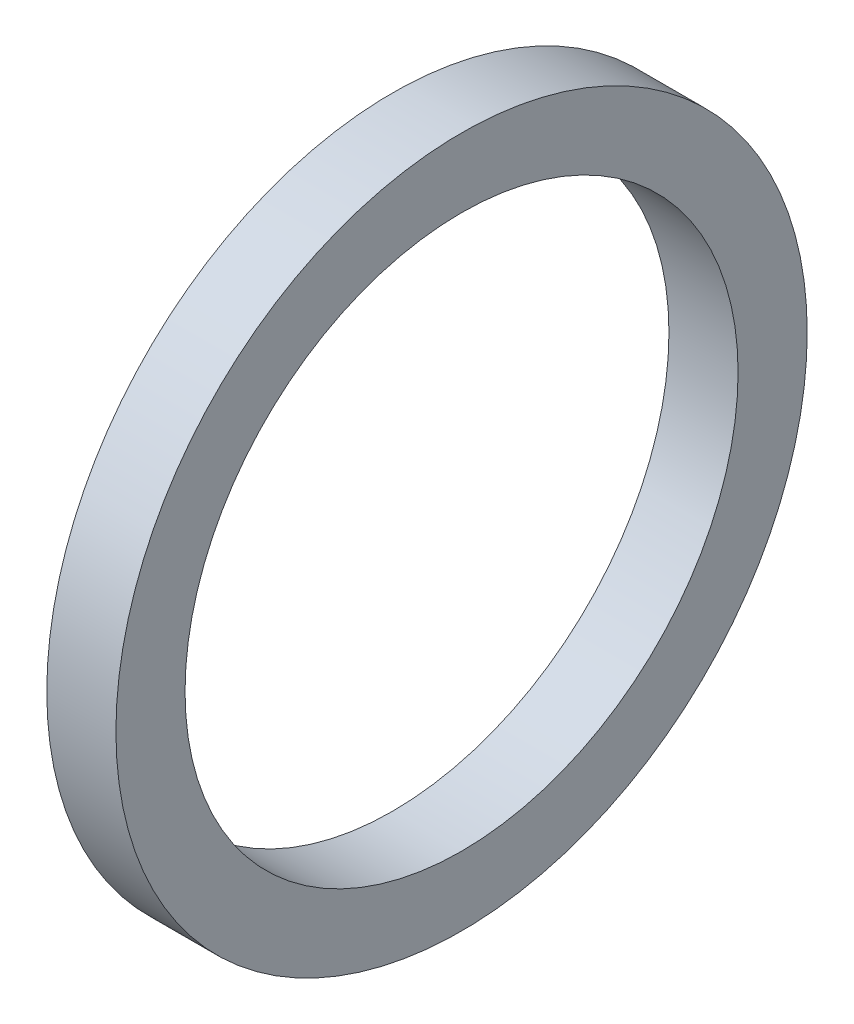
ISO-10303-21;
HEADER;
FILE_DESCRIPTION(('STEP AP214'),'2;1');
FILE_NAME('part.step','',(''),(''),'','','');
FILE_SCHEMA(('AUTOMOTIVE_DESIGN { 1 0 10303 214 1 1 1 1 }'));
ENDSEC;
DATA;
#1=APPLICATION_CONTEXT('core data for automotive mechanical design processes');
#2=APPLICATION_PROTOCOL_DEFINITION('international standard','automotive_design',2000,#1);
#3=PRODUCT_CONTEXT('',#1,'mechanical');
#4=PRODUCT('Part','Part','',(#3));
#5=PRODUCT_RELATED_PRODUCT_CATEGORY('part','',(#4));
#6=PRODUCT_DEFINITION_FORMATION('','',#4);
#7=PRODUCT_DEFINITION_CONTEXT('part definition',#1,'design');
#8=PRODUCT_DEFINITION('design','',#6,#7);
#9=PRODUCT_DEFINITION_SHAPE('','',#8);
#10=(LENGTH_UNIT() NAMED_UNIT(*) SI_UNIT(.MILLI.,.METRE.));
#11=(NAMED_UNIT(*) PLANE_ANGLE_UNIT() SI_UNIT($,.RADIAN.));
#12=(NAMED_UNIT(*) SI_UNIT($,.STERADIAN.) SOLID_ANGLE_UNIT());
#13=UNCERTAINTY_MEASURE_WITH_UNIT(LENGTH_MEASURE(1.E-05),#10,'distance_accuracy_value','');
#14=(GEOMETRIC_REPRESENTATION_CONTEXT(3) GLOBAL_UNCERTAINTY_ASSIGNED_CONTEXT((#13)) GLOBAL_UNIT_ASSIGNED_CONTEXT((#10,
#11,#12)) REPRESENTATION_CONTEXT('',''));
#15=CARTESIAN_POINT('',(0.,0.,0.));
#16=DIRECTION('',(0.,0.,1.));
#17=DIRECTION('',(1.,0.,0.));
#18=AXIS2_PLACEMENT_3D('',#15,#16,#17);
#19=CARTESIAN_POINT('',(0.,0.,-20.));
#20=DIRECTION('',(1.,0.,0.));
#21=DIRECTION('',(0.,0.,-1.));
#22=AXIS2_PLACEMENT_3D('',#19,#20,#21);
#23=PLANE('',#22);
#24=CARTESIAN_POINT('',(0.,0.,0.));
#25=DIRECTION('',(-1.,0.,0.));
#26=DIRECTION('',(0.,0.,1.));
#27=AXIS2_PLACEMENT_3D('',#24,#25,#26);
#28=CIRCLE('',#27,20.);
#29=CARTESIAN_POINT('',(0.,0.,20.));
#30=VERTEX_POINT('',#29);
#31=EDGE_CURVE('E54',#30,#30,#28,.T.);
#32=ORIENTED_EDGE('',*,*,#31,.F.);
#33=EDGE_LOOP('',(#32));
#34=FACE_BOUND('',#33,.T.);
#35=CARTESIAN_POINT('',(0.,0.,0.));
#36=DIRECTION('',(-1.,0.,0.));
#37=DIRECTION('',(0.,0.,1.));
#38=AXIS2_PLACEMENT_3D('',#35,#36,#37);
#39=CIRCLE('',#38,25.);
#40=CARTESIAN_POINT('',(0.,0.,25.));
#41=VERTEX_POINT('',#40);
#42=EDGE_CURVE('E10',#41,#41,#39,.T.);
#43=ORIENTED_EDGE('',*,*,#42,.T.);
#44=EDGE_LOOP('',(#43));
#45=FACE_BOUND('',#44,.T.);
#46=ADVANCED_FACE('F37',(#34,#45),#23,.F.);
#47=CARTESIAN_POINT('',(0.,0.,0.));
#48=DIRECTION('',(-1.,0.,0.));
#49=DIRECTION('',(0.,0.,1.));
#50=AXIS2_PLACEMENT_3D('',#47,#48,#49);
#51=CYLINDRICAL_SURFACE('',#50,25.);
#52=ORIENTED_EDGE('',*,*,#42,.F.);
#53=EDGE_LOOP('',(#52));
#54=FACE_BOUND('',#53,.T.);
#55=CARTESIAN_POINT('',(5.,0.,0.));
#56=DIRECTION('',(-1.,0.,0.));
#57=DIRECTION('',(0.,0.,1.));
#58=AXIS2_PLACEMENT_3D('',#55,#56,#57);
#59=CIRCLE('',#58,25.);
#60=CARTESIAN_POINT('',(5.,0.,25.));
#61=VERTEX_POINT('',#60);
#62=EDGE_CURVE('E44',#61,#61,#59,.T.);
#63=ORIENTED_EDGE('',*,*,#62,.T.);
#64=EDGE_LOOP('',(#63));
#65=FACE_BOUND('',#64,.T.);
#66=ADVANCED_FACE('F64',(#54,#65),#51,.T.);
#67=CARTESIAN_POINT('',(5.,0.,-20.));
#68=DIRECTION('',(-1.,0.,0.));
#69=DIRECTION('',(0.,0.,1.));
#70=AXIS2_PLACEMENT_3D('',#67,#68,#69);
#71=PLANE('',#70);
#72=ORIENTED_EDGE('',*,*,#62,.F.);
#73=EDGE_LOOP('',(#72));
#74=FACE_BOUND('',#73,.T.);
#75=CARTESIAN_POINT('',(5.,0.,0.));
#76=DIRECTION('',(-1.,0.,0.));
#77=DIRECTION('',(0.,0.,1.));
#78=AXIS2_PLACEMENT_3D('',#75,#76,#77);
#79=CIRCLE('',#78,20.);
#80=CARTESIAN_POINT('',(5.,0.,20.));
#81=VERTEX_POINT('',#80);
#82=EDGE_CURVE('E49',#81,#81,#79,.T.);
#83=ORIENTED_EDGE('',*,*,#82,.T.);
#84=EDGE_LOOP('',(#83));
#85=FACE_BOUND('',#84,.T.);
#86=ADVANCED_FACE('F68',(#74,#85),#71,.F.);
#87=CARTESIAN_POINT('',(0.,0.,0.));
#88=DIRECTION('',(-1.,0.,0.));
#89=DIRECTION('',(0.,0.,1.));
#90=AXIS2_PLACEMENT_3D('',#87,#88,#89);
#91=CYLINDRICAL_SURFACE('',#90,20.);
#92=ORIENTED_EDGE('',*,*,#82,.F.);
#93=EDGE_LOOP('',(#92));
#94=FACE_BOUND('',#93,.T.);
#95=ORIENTED_EDGE('',*,*,#31,.T.);
#96=EDGE_LOOP('',(#95));
#97=FACE_BOUND('',#96,.T.);
#98=ADVANCED_FACE('F61',(#94,#97),#91,.F.);
#99=CLOSED_SHELL('',(#46,#66,#86,#98));
#100=MANIFOLD_SOLID_BREP('B2',#99);
#101=ADVANCED_BREP_SHAPE_REPRESENTATION('',(#18,#100),#14);
#102=SHAPE_DEFINITION_REPRESENTATION(#9,#101);
ENDSEC;
END-ISO-10303-21;
